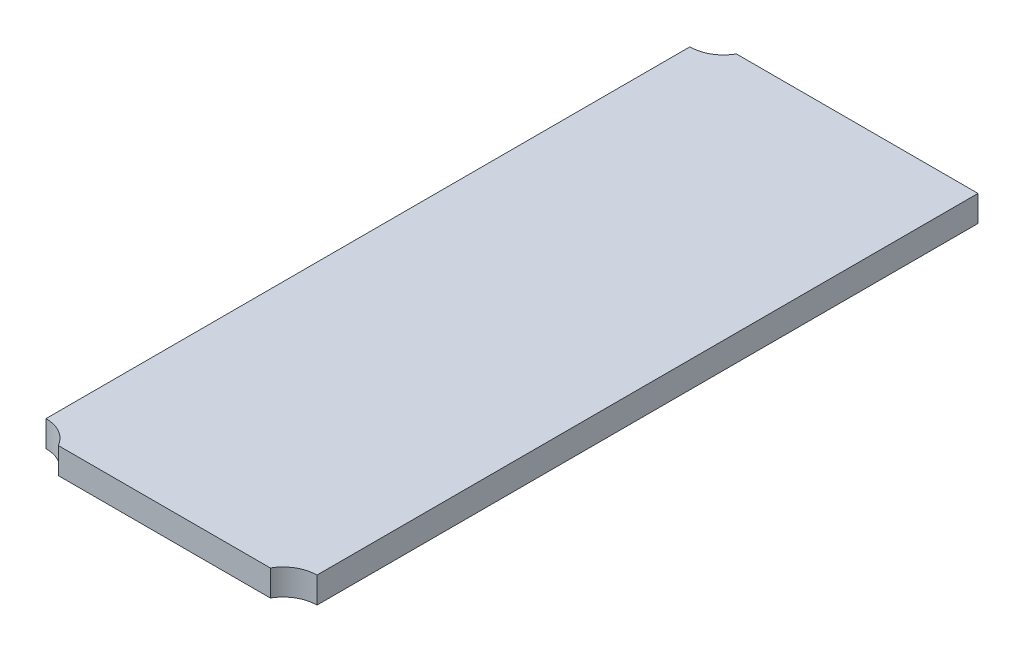
ISO-10303-21;
HEADER;
FILE_DESCRIPTION(('STEP AP214'),'2;1');
FILE_NAME('part.step','',(''),(''),'','','');
FILE_SCHEMA(('AUTOMOTIVE_DESIGN { 1 0 10303 214 1 1 1 1 }'));
ENDSEC;
DATA;
#1=APPLICATION_CONTEXT('core data for automotive mechanical design processes');
#2=APPLICATION_PROTOCOL_DEFINITION('international standard','automotive_design',2000,#1);
#3=PRODUCT_CONTEXT('',#1,'mechanical');
#4=PRODUCT('Part','Part','',(#3));
#5=PRODUCT_RELATED_PRODUCT_CATEGORY('part','',(#4));
#6=PRODUCT_DEFINITION_FORMATION('','',#4);
#7=PRODUCT_DEFINITION_CONTEXT('part definition',#1,'design');
#8=PRODUCT_DEFINITION('design','',#6,#7);
#9=PRODUCT_DEFINITION_SHAPE('','',#8);
#10=(LENGTH_UNIT() NAMED_UNIT(*) SI_UNIT(.MILLI.,.METRE.));
#11=(NAMED_UNIT(*) PLANE_ANGLE_UNIT() SI_UNIT($,.RADIAN.));
#12=(NAMED_UNIT(*) SI_UNIT($,.STERADIAN.) SOLID_ANGLE_UNIT());
#13=UNCERTAINTY_MEASURE_WITH_UNIT(LENGTH_MEASURE(1.E-05),#10,'distance_accuracy_value','');
#14=(GEOMETRIC_REPRESENTATION_CONTEXT(3) GLOBAL_UNCERTAINTY_ASSIGNED_CONTEXT((#13)) GLOBAL_UNIT_ASSIGNED_CONTEXT((#10,
#11,#12)) REPRESENTATION_CONTEXT('',''));
#15=CARTESIAN_POINT('',(0.,0.,0.));
#16=DIRECTION('',(0.,0.,1.));
#17=DIRECTION('',(1.,0.,0.));
#18=AXIS2_PLACEMENT_3D('',#15,#16,#17);
#19=CARTESIAN_POINT('',(0.,0.,0.));
#20=DIRECTION('',(0.,-1.,0.));
#21=DIRECTION('',(0.,0.,-1.));
#22=AXIS2_PLACEMENT_3D('',#19,#20,#21);
#23=PLANE('',#22);
#24=DIRECTION('',(1.,0.,0.));
#25=VECTOR('',#24,1.);
#26=CARTESIAN_POINT('',(5.82886903196313,0.,-4.6));
#27=LINE('',#26,#25);
#28=CARTESIAN_POINT('',(5.82886903196313,0.,-4.6));
#29=VERTEX_POINT('',#28);
#30=CARTESIAN_POINT('',(26.1711309680369,0.,-4.60000000000001));
#31=VERTEX_POINT('',#30);
#32=EDGE_CURVE('E117',#29,#31,#27,.T.);
#33=ORIENTED_EDGE('',*,*,#32,.F.);
#34=CARTESIAN_POINT('',(3.,0.,-3.));
#35=DIRECTION('',(0.,-1.,0.));
#36=DIRECTION('',(0.,0.,1.));
#37=AXIS2_PLACEMENT_3D('',#34,#35,#36);
#38=CIRCLE('',#37,3.25);
#39=CARTESIAN_POINT('',(3.,0.,-6.25));
#40=VERTEX_POINT('',#39);
#41=EDGE_CURVE('E63',#40,#29,#38,.T.);
#42=ORIENTED_EDGE('',*,*,#41,.F.);
#43=DIRECTION('',(0.,0.,1.));
#44=VECTOR('',#43,1.);
#45=CARTESIAN_POINT('',(3.,0.,-68.02));
#46=LINE('',#45,#44);
#47=CARTESIAN_POINT('',(3.,0.,-68.02));
#48=VERTEX_POINT('',#47);
#49=EDGE_CURVE('E132',#48,#40,#46,.T.);
#50=ORIENTED_EDGE('',*,*,#49,.F.);
#51=CARTESIAN_POINT('',(3.,0.,-71.27));
#52=DIRECTION('',(0.,-1.,0.));
#53=DIRECTION('',(0.,0.,1.));
#54=AXIS2_PLACEMENT_3D('',#51,#52,#53);
#55=CIRCLE('',#54,3.25);
#56=CARTESIAN_POINT('',(5.82886903196313,0.,-69.67));
#57=VERTEX_POINT('',#56);
#58=EDGE_CURVE('E125',#57,#48,#55,.T.);
#59=ORIENTED_EDGE('',*,*,#58,.F.);
#60=DIRECTION('',(-1.,0.,0.));
#61=VECTOR('',#60,1.);
#62=CARTESIAN_POINT('',(29.,0.,-69.67));
#63=LINE('',#62,#61);
#64=CARTESIAN_POINT('',(29.,0.,-69.67));
#65=VERTEX_POINT('',#64);
#66=EDGE_CURVE('E121',#65,#57,#63,.T.);
#67=ORIENTED_EDGE('',*,*,#66,.F.);
#68=DIRECTION('',(0.,0.,-1.));
#69=VECTOR('',#68,1.);
#70=CARTESIAN_POINT('',(29.,0.,-6.25000000000001));
#71=LINE('',#70,#69);
#72=CARTESIAN_POINT('',(29.,0.,-6.25000000000001));
#73=VERTEX_POINT('',#72);
#74=EDGE_CURVE('E102',#73,#65,#71,.T.);
#75=ORIENTED_EDGE('',*,*,#74,.F.);
#76=CARTESIAN_POINT('',(29.,0.,-3.00000000000001));
#77=DIRECTION('',(0.,-1.,0.));
#78=DIRECTION('',(0.,0.,1.));
#79=AXIS2_PLACEMENT_3D('',#76,#77,#78);
#80=CIRCLE('',#79,3.25);
#81=EDGE_CURVE('E111',#31,#73,#80,.T.);
#82=ORIENTED_EDGE('',*,*,#81,.F.);
#83=EDGE_LOOP('',(#33,#42,#50,#59,#67,#75,#82));
#84=FACE_BOUND('',#83,.T.);
#85=ADVANCED_FACE('F38',(#84),#23,.T.);
#86=CARTESIAN_POINT('',(3.,0.,-3.));
#87=DIRECTION('',(0.,1.,0.));
#88=DIRECTION('',(0.,0.,1.));
#89=AXIS2_PLACEMENT_3D('',#86,#87,#88);
#90=CYLINDRICAL_SURFACE('',#89,3.25);
#91=CARTESIAN_POINT('',(3.,2.5,-3.));
#92=DIRECTION('',(0.,-1.,0.));
#93=DIRECTION('',(0.,0.,1.));
#94=AXIS2_PLACEMENT_3D('',#91,#92,#93);
#95=CIRCLE('',#94,3.25);
#96=CARTESIAN_POINT('',(3.,2.5,-6.25));
#97=VERTEX_POINT('',#96);
#98=CARTESIAN_POINT('',(5.82886903196313,2.5,-4.6));
#99=VERTEX_POINT('',#98);
#100=EDGE_CURVE('E136',#97,#99,#95,.T.);
#101=ORIENTED_EDGE('',*,*,#100,.F.);
#102=DIRECTION('',(0.,1.,0.));
#103=VECTOR('',#102,1.);
#104=CARTESIAN_POINT('',(3.,0.,-6.25));
#105=LINE('',#104,#103);
#106=EDGE_CURVE('E11',#40,#97,#105,.T.);
#107=ORIENTED_EDGE('',*,*,#106,.F.);
#108=ORIENTED_EDGE('',*,*,#41,.T.);
#109=DIRECTION('',(0.,1.,0.));
#110=VECTOR('',#109,1.);
#111=CARTESIAN_POINT('',(5.82886903196313,0.,-4.6));
#112=LINE('',#111,#110);
#113=EDGE_CURVE('E41',#29,#99,#112,.T.);
#114=ORIENTED_EDGE('',*,*,#113,.T.);
#115=EDGE_LOOP('',(#101,#107,#108,#114));
#116=FACE_BOUND('',#115,.T.);
#117=ADVANCED_FACE('F171',(#116),#90,.F.);
#118=CARTESIAN_POINT('',(3.,0.,-68.02));
#119=DIRECTION('',(-1.,0.,0.));
#120=DIRECTION('',(0.,0.,1.));
#121=AXIS2_PLACEMENT_3D('',#118,#119,#120);
#122=PLANE('',#121);
#123=DIRECTION('',(0.,0.,1.));
#124=VECTOR('',#123,1.);
#125=CARTESIAN_POINT('',(3.,2.5,-68.02));
#126=LINE('',#125,#124);
#127=CARTESIAN_POINT('',(3.,2.5,-68.02));
#128=VERTEX_POINT('',#127);
#129=EDGE_CURVE('E156',#128,#97,#126,.T.);
#130=ORIENTED_EDGE('',*,*,#129,.F.);
#131=DIRECTION('',(0.,1.,0.));
#132=VECTOR('',#131,1.);
#133=CARTESIAN_POINT('',(3.,0.,-68.02));
#134=LINE('',#133,#132);
#135=EDGE_CURVE('E47',#48,#128,#134,.T.);
#136=ORIENTED_EDGE('',*,*,#135,.F.);
#137=ORIENTED_EDGE('',*,*,#49,.T.);
#138=ORIENTED_EDGE('',*,*,#106,.T.);
#139=EDGE_LOOP('',(#130,#136,#137,#138));
#140=FACE_BOUND('',#139,.T.);
#141=ADVANCED_FACE('F178',(#140),#122,.T.);
#142=CARTESIAN_POINT('',(3.,0.,-71.27));
#143=DIRECTION('',(0.,1.,0.));
#144=DIRECTION('',(0.,0.,1.));
#145=AXIS2_PLACEMENT_3D('',#142,#143,#144);
#146=CYLINDRICAL_SURFACE('',#145,3.25);
#147=CARTESIAN_POINT('',(3.,2.5,-71.27));
#148=DIRECTION('',(0.,-1.,0.));
#149=DIRECTION('',(0.,0.,1.));
#150=AXIS2_PLACEMENT_3D('',#147,#148,#149);
#151=CIRCLE('',#150,3.25);
#152=CARTESIAN_POINT('',(5.82886903196313,2.5,-69.67));
#153=VERTEX_POINT('',#152);
#154=EDGE_CURVE('E152',#153,#128,#151,.T.);
#155=ORIENTED_EDGE('',*,*,#154,.F.);
#156=DIRECTION('',(0.,1.,0.));
#157=VECTOR('',#156,1.);
#158=CARTESIAN_POINT('',(5.82886903196313,0.,-69.67));
#159=LINE('',#158,#157);
#160=EDGE_CURVE('E162',#57,#153,#159,.T.);
#161=ORIENTED_EDGE('',*,*,#160,.F.);
#162=ORIENTED_EDGE('',*,*,#58,.T.);
#163=ORIENTED_EDGE('',*,*,#135,.T.);
#164=EDGE_LOOP('',(#155,#161,#162,#163));
#165=FACE_BOUND('',#164,.T.);
#166=ADVANCED_FACE('F184',(#165),#146,.F.);
#167=CARTESIAN_POINT('',(29.,0.,-69.67));
#168=DIRECTION('',(0.,0.,-1.));
#169=DIRECTION('',(-1.,0.,0.));
#170=AXIS2_PLACEMENT_3D('',#167,#168,#169);
#171=PLANE('',#170);
#172=DIRECTION('',(-1.,0.,0.));
#173=VECTOR('',#172,1.);
#174=CARTESIAN_POINT('',(29.,2.5,-69.67));
#175=LINE('',#174,#173);
#176=CARTESIAN_POINT('',(29.,2.5,-69.67));
#177=VERTEX_POINT('',#176);
#178=EDGE_CURVE('E148',#177,#153,#175,.T.);
#179=ORIENTED_EDGE('',*,*,#178,.F.);
#180=DIRECTION('',(0.,1.,0.));
#181=VECTOR('',#180,1.);
#182=CARTESIAN_POINT('',(29.,0.,-69.67));
#183=LINE('',#182,#181);
#184=EDGE_CURVE('E107',#65,#177,#183,.T.);
#185=ORIENTED_EDGE('',*,*,#184,.F.);
#186=ORIENTED_EDGE('',*,*,#66,.T.);
#187=ORIENTED_EDGE('',*,*,#160,.T.);
#188=EDGE_LOOP('',(#179,#185,#186,#187));
#189=FACE_BOUND('',#188,.T.);
#190=ADVANCED_FACE('F187',(#189),#171,.T.);
#191=CARTESIAN_POINT('',(29.,0.,-6.25000000000001));
#192=DIRECTION('',(1.,0.,0.));
#193=DIRECTION('',(0.,0.,-1.));
#194=AXIS2_PLACEMENT_3D('',#191,#192,#193);
#195=PLANE('',#194);
#196=DIRECTION('',(0.,0.,-1.));
#197=VECTOR('',#196,1.);
#198=CARTESIAN_POINT('',(29.,2.5,-6.25000000000001));
#199=LINE('',#198,#197);
#200=CARTESIAN_POINT('',(29.,2.5,-6.25000000000001));
#201=VERTEX_POINT('',#200);
#202=EDGE_CURVE('E105',#201,#177,#199,.T.);
#203=ORIENTED_EDGE('',*,*,#202,.F.);
#204=DIRECTION('',(0.,1.,0.));
#205=VECTOR('',#204,1.);
#206=CARTESIAN_POINT('',(29.,0.,-6.25000000000001));
#207=LINE('',#206,#205);
#208=EDGE_CURVE('E98',#73,#201,#207,.T.);
#209=ORIENTED_EDGE('',*,*,#208,.F.);
#210=ORIENTED_EDGE('',*,*,#74,.T.);
#211=ORIENTED_EDGE('',*,*,#184,.T.);
#212=EDGE_LOOP('',(#203,#209,#210,#211));
#213=FACE_BOUND('',#212,.T.);
#214=ADVANCED_FACE('F100',(#213),#195,.T.);
#215=CARTESIAN_POINT('',(29.,0.,-3.00000000000001));
#216=DIRECTION('',(0.,1.,0.));
#217=DIRECTION('',(0.,0.,1.));
#218=AXIS2_PLACEMENT_3D('',#215,#216,#217);
#219=CYLINDRICAL_SURFACE('',#218,3.25);
#220=CARTESIAN_POINT('',(29.,2.5,-3.00000000000001));
#221=DIRECTION('',(0.,-1.,0.));
#222=DIRECTION('',(0.,0.,1.));
#223=AXIS2_PLACEMENT_3D('',#220,#221,#222);
#224=CIRCLE('',#223,3.25);
#225=CARTESIAN_POINT('',(26.1711309680369,2.5,-4.60000000000001));
#226=VERTEX_POINT('',#225);
#227=EDGE_CURVE('E55',#226,#201,#224,.T.);
#228=ORIENTED_EDGE('',*,*,#227,.F.);
#229=DIRECTION('',(0.,1.,0.));
#230=VECTOR('',#229,1.);
#231=CARTESIAN_POINT('',(26.1711309680369,0.,-4.60000000000001));
#232=LINE('',#231,#230);
#233=EDGE_CURVE('E108',#31,#226,#232,.T.);
#234=ORIENTED_EDGE('',*,*,#233,.F.);
#235=ORIENTED_EDGE('',*,*,#81,.T.);
#236=ORIENTED_EDGE('',*,*,#208,.T.);
#237=EDGE_LOOP('',(#228,#234,#235,#236));
#238=FACE_BOUND('',#237,.T.);
#239=ADVANCED_FACE('F112',(#238),#219,.F.);
#240=CARTESIAN_POINT('',(5.82886903196313,0.,-4.6));
#241=DIRECTION('',(0.,0.,1.));
#242=DIRECTION('',(1.,0.,0.));
#243=AXIS2_PLACEMENT_3D('',#240,#241,#242);
#244=PLANE('',#243);
#245=DIRECTION('',(1.,0.,0.));
#246=VECTOR('',#245,1.);
#247=CARTESIAN_POINT('',(5.82886903196313,2.5,-4.6));
#248=LINE('',#247,#246);
#249=EDGE_CURVE('E140',#99,#226,#248,.T.);
#250=ORIENTED_EDGE('',*,*,#249,.F.);
#251=ORIENTED_EDGE('',*,*,#113,.F.);
#252=ORIENTED_EDGE('',*,*,#32,.T.);
#253=ORIENTED_EDGE('',*,*,#233,.T.);
#254=EDGE_LOOP('',(#250,#251,#252,#253));
#255=FACE_BOUND('',#254,.T.);
#256=ADVANCED_FACE('F172',(#255),#244,.T.);
#257=CARTESIAN_POINT('',(0.,2.5,0.));
#258=DIRECTION('',(0.,-1.,0.));
#259=DIRECTION('',(0.,0.,-1.));
#260=AXIS2_PLACEMENT_3D('',#257,#258,#259);
#261=PLANE('',#260);
#262=ORIENTED_EDGE('',*,*,#100,.T.);
#263=ORIENTED_EDGE('',*,*,#249,.T.);
#264=ORIENTED_EDGE('',*,*,#227,.T.);
#265=ORIENTED_EDGE('',*,*,#202,.T.);
#266=ORIENTED_EDGE('',*,*,#178,.T.);
#267=ORIENTED_EDGE('',*,*,#154,.T.);
#268=ORIENTED_EDGE('',*,*,#129,.T.);
#269=EDGE_LOOP('',(#262,#263,#264,#265,#266,#267,#268));
#270=FACE_BOUND('',#269,.T.);
#271=ADVANCED_FACE('F174',(#270),#261,.F.);
#272=CLOSED_SHELL('',(#85,#117,#141,#166,#190,#214,#239,#256,#271));
#273=MANIFOLD_SOLID_BREP('B2',#272);
#274=ADVANCED_BREP_SHAPE_REPRESENTATION('',(#18,#273),#14);
#275=SHAPE_DEFINITION_REPRESENTATION(#9,#274);
ENDSEC;
END-ISO-10303-21;
